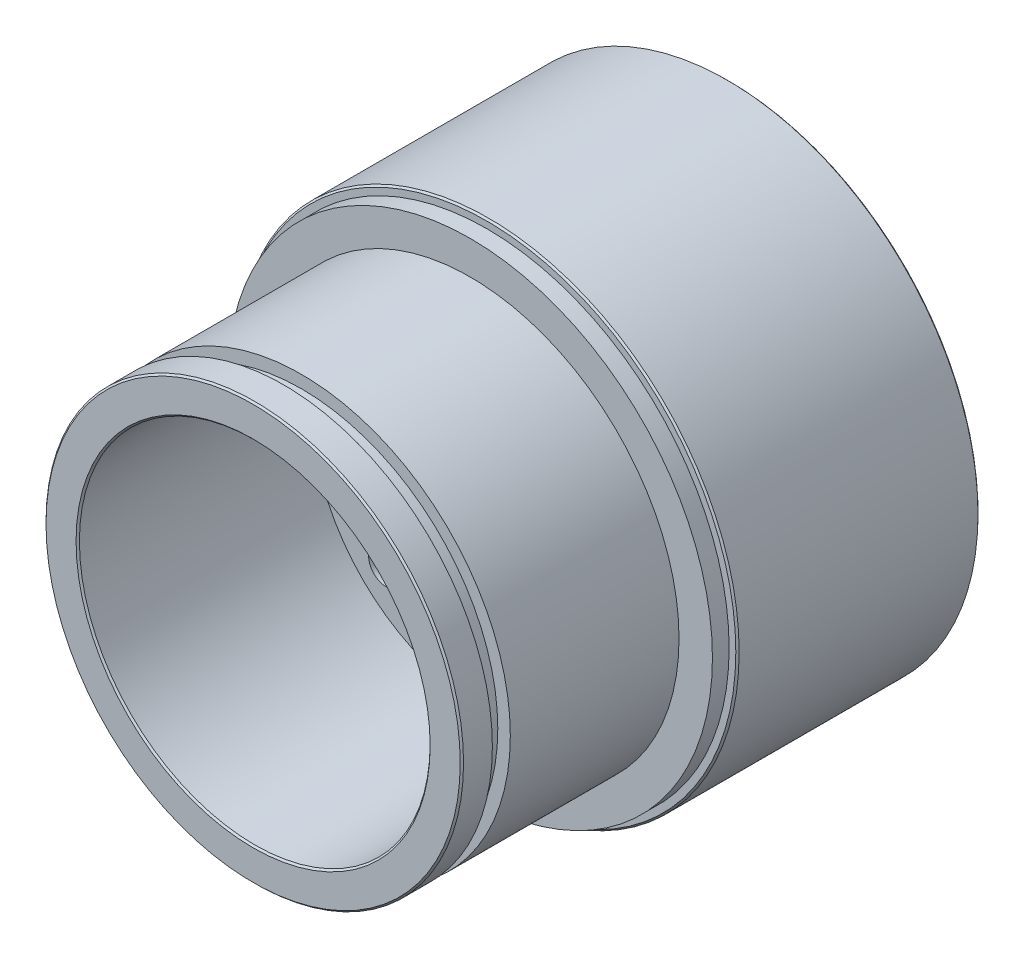
ISO-10303-21;
HEADER;
FILE_DESCRIPTION(('STEP AP214'),'2;1');
FILE_NAME('part.step','',(''),(''),'','','');
FILE_SCHEMA(('AUTOMOTIVE_DESIGN { 1 0 10303 214 1 1 1 1 }'));
ENDSEC;
DATA;
#1=APPLICATION_CONTEXT('core data for automotive mechanical design processes');
#2=APPLICATION_PROTOCOL_DEFINITION('international standard','automotive_design',2000,#1);
#3=PRODUCT_CONTEXT('',#1,'mechanical');
#4=PRODUCT('Part','Part','',(#3));
#5=PRODUCT_RELATED_PRODUCT_CATEGORY('part','',(#4));
#6=PRODUCT_DEFINITION_FORMATION('','',#4);
#7=PRODUCT_DEFINITION_CONTEXT('part definition',#1,'design');
#8=PRODUCT_DEFINITION('design','',#6,#7);
#9=PRODUCT_DEFINITION_SHAPE('','',#8);
#10=(LENGTH_UNIT() NAMED_UNIT(*) SI_UNIT(.MILLI.,.METRE.));
#11=(NAMED_UNIT(*) PLANE_ANGLE_UNIT() SI_UNIT($,.RADIAN.));
#12=(NAMED_UNIT(*) SI_UNIT($,.STERADIAN.) SOLID_ANGLE_UNIT());
#13=UNCERTAINTY_MEASURE_WITH_UNIT(LENGTH_MEASURE(1.E-05),#10,'distance_accuracy_value','');
#14=(GEOMETRIC_REPRESENTATION_CONTEXT(3) GLOBAL_UNCERTAINTY_ASSIGNED_CONTEXT((#13)) GLOBAL_UNIT_ASSIGNED_CONTEXT((#10,
#11,#12)) REPRESENTATION_CONTEXT('',''));
#15=CARTESIAN_POINT('',(0.,0.,0.));
#16=DIRECTION('',(0.,0.,1.));
#17=DIRECTION('',(1.,0.,0.));
#18=AXIS2_PLACEMENT_3D('',#15,#16,#17);
#19=CARTESIAN_POINT('',(0.,0.,0.));
#20=DIRECTION('',(0.,0.,1.));
#21=DIRECTION('',(1.,0.,0.));
#22=AXIS2_PLACEMENT_3D('',#19,#20,#21);
#23=CYLINDRICAL_SURFACE('',#22,25.);
#24=CARTESIAN_POINT('',(0.,0.,27.8));
#25=DIRECTION('',(0.,0.,1.));
#26=DIRECTION('',(1.,0.,0.));
#27=AXIS2_PLACEMENT_3D('',#24,#25,#26);
#28=CIRCLE('',#27,25.);
#29=CARTESIAN_POINT('',(25.,0.,27.8));
#30=VERTEX_POINT('',#29);
#31=EDGE_CURVE('E46',#30,#30,#28,.F.);
#32=ORIENTED_EDGE('',*,*,#31,.T.);
#33=EDGE_LOOP('',(#32));
#34=FACE_BOUND('',#33,.T.);
#35=CARTESIAN_POINT('',(0.,0.,24.35));
#36=DIRECTION('',(0.,0.,-1.));
#37=DIRECTION('',(-1.,0.,0.));
#38=AXIS2_PLACEMENT_3D('',#35,#36,#37);
#39=CIRCLE('',#38,25.);
#40=CARTESIAN_POINT('',(-25.,0.,24.35));
#41=VERTEX_POINT('',#40);
#42=EDGE_CURVE('E140',#41,#41,#39,.T.);
#43=ORIENTED_EDGE('',*,*,#42,.F.);
#44=EDGE_LOOP('',(#43));
#45=FACE_BOUND('',#44,.T.);
#46=ADVANCED_FACE('F37',(#34,#45),#23,.T.);
#47=CARTESIAN_POINT('',(0.,0.,2.));
#48=DIRECTION('',(0.,0.,1.));
#49=DIRECTION('',(1.,0.,0.));
#50=AXIS2_PLACEMENT_3D('',#47,#48,#49);
#51=CIRCLE('',#50,25.);
#52=CARTESIAN_POINT('',(25.,0.,2.));
#53=VERTEX_POINT('',#52);
#54=EDGE_CURVE('E155',#53,#53,#51,.T.);
#55=ORIENTED_EDGE('',*,*,#54,.T.);
#56=EDGE_LOOP('',(#55));
#57=FACE_BOUND('',#56,.T.);
#58=CARTESIAN_POINT('',(0.,0.,22.2));
#59=DIRECTION('',(0.,0.,-1.));
#60=DIRECTION('',(-1.,0.,0.));
#61=AXIS2_PLACEMENT_3D('',#58,#59,#60);
#62=CIRCLE('',#61,25.);
#63=CARTESIAN_POINT('',(-25.,0.,22.2));
#64=VERTEX_POINT('',#63);
#65=EDGE_CURVE('E131',#64,#64,#62,.T.);
#66=ORIENTED_EDGE('',*,*,#65,.T.);
#67=EDGE_LOOP('',(#66));
#68=FACE_BOUND('',#67,.T.);
#69=ADVANCED_FACE('F227',(#57,#68),#23,.T.);
#70=CARTESIAN_POINT('',(0.,0.,0.));
#71=DIRECTION('',(0.,0.,1.));
#72=DIRECTION('',(1.,0.,0.));
#73=AXIS2_PLACEMENT_3D('',#70,#71,#72);
#74=CYLINDRICAL_SURFACE('',#73,13.);
#75=CARTESIAN_POINT('',(0.,0.,0.));
#76=DIRECTION('',(0.,0.,1.));
#77=DIRECTION('',(1.,0.,0.));
#78=AXIS2_PLACEMENT_3D('',#75,#76,#77);
#79=CIRCLE('',#78,13.);
#80=CARTESIAN_POINT('',(13.,0.,0.));
#81=VERTEX_POINT('',#80);
#82=EDGE_CURVE('E161',#81,#81,#79,.T.);
#83=ORIENTED_EDGE('',*,*,#82,.T.);
#84=EDGE_LOOP('',(#83));
#85=FACE_BOUND('',#84,.T.);
#86=CARTESIAN_POINT('',(0.,0.,-4.));
#87=DIRECTION('',(0.,0.,1.));
#88=DIRECTION('',(1.,0.,0.));
#89=AXIS2_PLACEMENT_3D('',#86,#87,#88);
#90=CIRCLE('',#89,13.);
#91=CARTESIAN_POINT('',(13.,0.,-4.));
#92=VERTEX_POINT('',#91);
#93=EDGE_CURVE('E143',#92,#92,#90,.T.);
#94=ORIENTED_EDGE('',*,*,#93,.F.);
#95=EDGE_LOOP('',(#94));
#96=FACE_BOUND('',#95,.T.);
#97=ADVANCED_FACE('F220',(#85,#96),#74,.F.);
#98=CARTESIAN_POINT('',(13.,0.,0.));
#99=DIRECTION('',(0.,0.,1.));
#100=DIRECTION('',(1.,0.,0.));
#101=AXIS2_PLACEMENT_3D('',#98,#99,#100);
#102=PLANE('',#101);
#103=CARTESIAN_POINT('',(12.0208152801712,12.0208152801714,0.));
#104=DIRECTION('',(0.,0.,1.));
#105=DIRECTION('',(0.,-1.,0.));
#106=AXIS2_PLACEMENT_3D('',#103,#104,#105);
#107=CIRCLE('',#106,2.15);
#108=CARTESIAN_POINT('',(12.0208152801712,9.87081528017138,0.));
#109=VERTEX_POINT('',#108);
#110=EDGE_CURVE('E110',#109,#109,#107,.T.);
#111=ORIENTED_EDGE('',*,*,#110,.F.);
#112=EDGE_LOOP('',(#111));
#113=FACE_BOUND('',#112,.T.);
#114=CARTESIAN_POINT('',(12.0208152801712,-12.0208152801714,0.));
#115=DIRECTION('',(0.,0.,1.));
#116=DIRECTION('',(1.,0.,0.));
#117=AXIS2_PLACEMENT_3D('',#114,#115,#116);
#118=CIRCLE('',#117,2.15);
#119=CARTESIAN_POINT('',(14.1708152801712,-12.0208152801714,0.));
#120=VERTEX_POINT('',#119);
#121=EDGE_CURVE('E116',#120,#120,#118,.T.);
#122=ORIENTED_EDGE('',*,*,#121,.F.);
#123=EDGE_LOOP('',(#122));
#124=FACE_BOUND('',#123,.T.);
#125=CARTESIAN_POINT('',(-12.0208152801713,-12.0208152801713,0.));
#126=DIRECTION('',(0.,0.,1.));
#127=DIRECTION('',(0.,-1.,0.));
#128=AXIS2_PLACEMENT_3D('',#125,#126,#127);
#129=CIRCLE('',#128,2.15);
#130=CARTESIAN_POINT('',(-12.0208152801713,-14.1708152801713,0.));
#131=VERTEX_POINT('',#130);
#132=EDGE_CURVE('E119',#131,#131,#129,.T.);
#133=ORIENTED_EDGE('',*,*,#132,.F.);
#134=EDGE_LOOP('',(#133));
#135=FACE_BOUND('',#134,.T.);
#136=CARTESIAN_POINT('',(-12.0208152801712,12.0208152801714,0.));
#137=DIRECTION('',(0.,0.,1.));
#138=DIRECTION('',(1.,0.,0.));
#139=AXIS2_PLACEMENT_3D('',#136,#137,#138);
#140=CIRCLE('',#139,2.15);
#141=CARTESIAN_POINT('',(-9.87081528017125,12.0208152801714,0.));
#142=VERTEX_POINT('',#141);
#143=EDGE_CURVE('E125',#142,#142,#140,.T.);
#144=ORIENTED_EDGE('',*,*,#143,.F.);
#145=EDGE_LOOP('',(#144));
#146=FACE_BOUND('',#145,.T.);
#147=CARTESIAN_POINT('',(0.,0.,0.));
#148=DIRECTION('',(0.,0.,1.));
#149=DIRECTION('',(1.,0.,0.));
#150=AXIS2_PLACEMENT_3D('',#147,#148,#149);
#151=CIRCLE('',#150,21.);
#152=CARTESIAN_POINT('',(21.,0.,0.));
#153=VERTEX_POINT('',#152);
#154=EDGE_CURVE('E158',#153,#153,#151,.T.);
#155=ORIENTED_EDGE('',*,*,#154,.T.);
#156=EDGE_LOOP('',(#155));
#157=FACE_BOUND('',#156,.T.);
#158=ORIENTED_EDGE('',*,*,#82,.F.);
#159=EDGE_LOOP('',(#158));
#160=FACE_BOUND('',#159,.T.);
#161=ADVANCED_FACE('F214',(#113,#124,#135,#146,#157,#160),#102,.T.);
#162=CARTESIAN_POINT('',(0.,0.,0.));
#163=DIRECTION('',(0.,0.,1.));
#164=DIRECTION('',(1.,0.,0.));
#165=AXIS2_PLACEMENT_3D('',#162,#163,#164);
#166=CYLINDRICAL_SURFACE('',#165,21.);
#167=CARTESIAN_POINT('',(0.,0.,27.8));
#168=DIRECTION('',(0.,0.,1.));
#169=DIRECTION('',(1.,0.,0.));
#170=AXIS2_PLACEMENT_3D('',#167,#168,#169);
#171=CIRCLE('',#170,21.);
#172=CARTESIAN_POINT('',(21.,0.,27.8));
#173=VERTEX_POINT('',#172);
#174=EDGE_CURVE('E12',#173,#173,#171,.T.);
#175=ORIENTED_EDGE('',*,*,#174,.T.);
#176=EDGE_LOOP('',(#175));
#177=FACE_BOUND('',#176,.T.);
#178=ORIENTED_EDGE('',*,*,#154,.F.);
#179=EDGE_LOOP('',(#178));
#180=FACE_BOUND('',#179,.T.);
#181=ADVANCED_FACE('F203',(#177,#180),#166,.F.);
#182=CARTESIAN_POINT('',(21.,0.,28.));
#183=DIRECTION('',(0.,0.,1.));
#184=DIRECTION('',(1.,0.,0.));
#185=AXIS2_PLACEMENT_3D('',#182,#183,#184);
#186=PLANE('',#185);
#187=CARTESIAN_POINT('',(0.,0.,28.));
#188=DIRECTION('',(0.,0.,1.));
#189=DIRECTION('',(1.,0.,0.));
#190=AXIS2_PLACEMENT_3D('',#187,#188,#189);
#191=CIRCLE('',#190,24.8);
#192=CARTESIAN_POINT('',(24.8,0.,28.));
#193=VERTEX_POINT('',#192);
#194=EDGE_CURVE('E185',#193,#193,#191,.T.);
#195=ORIENTED_EDGE('',*,*,#194,.T.);
#196=EDGE_LOOP('',(#195));
#197=FACE_BOUND('',#196,.T.);
#198=CARTESIAN_POINT('',(0.,0.,28.));
#199=DIRECTION('',(0.,0.,1.));
#200=DIRECTION('',(1.,0.,0.));
#201=AXIS2_PLACEMENT_3D('',#198,#199,#200);
#202=CIRCLE('',#201,21.2);
#203=CARTESIAN_POINT('',(21.2,0.,28.));
#204=VERTEX_POINT('',#203);
#205=EDGE_CURVE('E182',#204,#204,#202,.F.);
#206=ORIENTED_EDGE('',*,*,#205,.T.);
#207=EDGE_LOOP('',(#206));
#208=FACE_BOUND('',#207,.T.);
#209=ADVANCED_FACE('F199',(#197,#208),#186,.T.);
#210=CARTESIAN_POINT('',(25.,0.,2.));
#211=DIRECTION('',(0.,0.,1.));
#212=DIRECTION('',(1.,0.,0.));
#213=AXIS2_PLACEMENT_3D('',#210,#211,#212);
#214=PLANE('',#213);
#215=CARTESIAN_POINT('',(0.,0.,2.));
#216=DIRECTION('',(0.,0.,1.));
#217=DIRECTION('',(1.,0.,0.));
#218=AXIS2_PLACEMENT_3D('',#215,#216,#217);
#219=CIRCLE('',#218,29.);
#220=CARTESIAN_POINT('',(29.,0.,2.));
#221=VERTEX_POINT('',#220);
#222=EDGE_CURVE('E152',#221,#221,#219,.T.);
#223=ORIENTED_EDGE('',*,*,#222,.T.);
#224=EDGE_LOOP('',(#223));
#225=FACE_BOUND('',#224,.T.);
#226=ORIENTED_EDGE('',*,*,#54,.F.);
#227=EDGE_LOOP('',(#226));
#228=FACE_BOUND('',#227,.T.);
#229=ADVANCED_FACE('F202',(#225,#228),#214,.T.);
#230=CARTESIAN_POINT('',(0.,0.,0.));
#231=DIRECTION('',(0.,0.,1.));
#232=DIRECTION('',(1.,0.,0.));
#233=AXIS2_PLACEMENT_3D('',#230,#231,#232);
#234=CYLINDRICAL_SURFACE('',#233,29.);
#235=CARTESIAN_POINT('',(0.,0.,0.));
#236=DIRECTION('',(0.,0.,1.));
#237=DIRECTION('',(1.,0.,0.));
#238=AXIS2_PLACEMENT_3D('',#235,#236,#237);
#239=CIRCLE('',#238,29.);
#240=CARTESIAN_POINT('',(29.,0.,0.));
#241=VERTEX_POINT('',#240);
#242=EDGE_CURVE('E149',#241,#241,#239,.T.);
#243=ORIENTED_EDGE('',*,*,#242,.T.);
#244=EDGE_LOOP('',(#243));
#245=FACE_BOUND('',#244,.T.);
#246=ORIENTED_EDGE('',*,*,#222,.F.);
#247=EDGE_LOOP('',(#246));
#248=FACE_BOUND('',#247,.T.);
#249=ADVANCED_FACE('F283',(#245,#248),#234,.T.);
#250=CARTESIAN_POINT('',(29.,0.,0.));
#251=DIRECTION('',(0.,0.,1.));
#252=DIRECTION('',(1.,0.,0.));
#253=AXIS2_PLACEMENT_3D('',#250,#251,#252);
#254=PLANE('',#253);
#255=CARTESIAN_POINT('',(0.,0.,0.));
#256=DIRECTION('',(0.,0.,1.));
#257=DIRECTION('',(1.,0.,0.));
#258=AXIS2_PLACEMENT_3D('',#255,#256,#257);
#259=CIRCLE('',#258,29.8);
#260=CARTESIAN_POINT('',(29.8,0.,0.));
#261=VERTEX_POINT('',#260);
#262=EDGE_CURVE('E164',#261,#261,#259,.T.);
#263=ORIENTED_EDGE('',*,*,#262,.T.);
#264=EDGE_LOOP('',(#263));
#265=FACE_BOUND('',#264,.T.);
#266=ORIENTED_EDGE('',*,*,#242,.F.);
#267=EDGE_LOOP('',(#266));
#268=FACE_BOUND('',#267,.T.);
#269=ADVANCED_FACE('F277',(#265,#268),#254,.T.);
#270=CARTESIAN_POINT('',(0.,0.,0.));
#271=DIRECTION('',(0.,0.,1.));
#272=DIRECTION('',(1.,0.,0.));
#273=AXIS2_PLACEMENT_3D('',#270,#271,#272);
#274=CYLINDRICAL_SURFACE('',#273,30.);
#275=CARTESIAN_POINT('',(0.,0.,-0.200000000000023));
#276=DIRECTION('',(0.,0.,1.));
#277=DIRECTION('',(1.,0.,0.));
#278=AXIS2_PLACEMENT_3D('',#275,#276,#277);
#279=CIRCLE('',#278,30.);
#280=CARTESIAN_POINT('',(30.,0.,-0.200000000000023));
#281=VERTEX_POINT('',#280);
#282=EDGE_CURVE('E170',#281,#281,#279,.F.);
#283=ORIENTED_EDGE('',*,*,#282,.T.);
#284=EDGE_LOOP('',(#283));
#285=FACE_BOUND('',#284,.T.);
#286=CARTESIAN_POINT('',(0.,0.,-28.8));
#287=DIRECTION('',(0.,0.,-1.));
#288=DIRECTION('',(-1.,0.,0.));
#289=AXIS2_PLACEMENT_3D('',#286,#287,#288);
#290=CIRCLE('',#289,30.);
#291=CARTESIAN_POINT('',(-30.,0.,-28.8));
#292=VERTEX_POINT('',#291);
#293=EDGE_CURVE('E167',#292,#292,#290,.F.);
#294=ORIENTED_EDGE('',*,*,#293,.T.);
#295=EDGE_LOOP('',(#294));
#296=FACE_BOUND('',#295,.T.);
#297=ADVANCED_FACE('F247',(#285,#296),#274,.T.);
#298=CARTESIAN_POINT('',(30.,0.,-29.));
#299=DIRECTION('',(0.,0.,-1.));
#300=DIRECTION('',(-1.,0.,0.));
#301=AXIS2_PLACEMENT_3D('',#298,#299,#300);
#302=PLANE('',#301);
#303=CARTESIAN_POINT('',(-21.6506350946108,12.5000000000003,-29.));
#304=DIRECTION('',(0.,0.,-1.));
#305=DIRECTION('',(0.,1.,0.));
#306=AXIS2_PLACEMENT_3D('',#303,#304,#305);
#307=CIRCLE('',#306,1.65);
#308=CARTESIAN_POINT('',(-21.6506350946108,14.1500000000003,-29.));
#309=VERTEX_POINT('',#308);
#310=EDGE_CURVE('E76',#309,#309,#307,.T.);
#311=ORIENTED_EDGE('',*,*,#310,.F.);
#312=EDGE_LOOP('',(#311));
#313=FACE_BOUND('',#312,.T.);
#314=CARTESIAN_POINT('',(-21.6506350946111,-12.4999999999998,-29.));
#315=DIRECTION('',(0.,0.,-1.));
#316=DIRECTION('',(0.,1.,0.));
#317=AXIS2_PLACEMENT_3D('',#314,#315,#316);
#318=CIRCLE('',#317,1.65);
#319=CARTESIAN_POINT('',(-21.6506350946111,-10.8499999999998,-29.));
#320=VERTEX_POINT('',#319);
#321=EDGE_CURVE('E75',#320,#320,#318,.T.);
#322=ORIENTED_EDGE('',*,*,#321,.F.);
#323=EDGE_LOOP('',(#322));
#324=FACE_BOUND('',#323,.T.);
#325=CARTESIAN_POINT('',(0.,-25.,-29.));
#326=DIRECTION('',(0.,0.,-1.));
#327=DIRECTION('',(-1.,0.,0.));
#328=AXIS2_PLACEMENT_3D('',#325,#326,#327);
#329=CIRCLE('',#328,1.65);
#330=CARTESIAN_POINT('',(-1.65,-25.,-29.));
#331=VERTEX_POINT('',#330);
#332=EDGE_CURVE('E86',#331,#331,#329,.T.);
#333=ORIENTED_EDGE('',*,*,#332,.F.);
#334=EDGE_LOOP('',(#333));
#335=FACE_BOUND('',#334,.T.);
#336=CARTESIAN_POINT('',(21.6506350946109,-12.5000000000001,-29.));
#337=DIRECTION('',(0.,0.,-1.));
#338=DIRECTION('',(0.,1.,0.));
#339=AXIS2_PLACEMENT_3D('',#336,#337,#338);
#340=CIRCLE('',#339,1.65);
#341=CARTESIAN_POINT('',(21.6506350946109,-10.8500000000001,-29.));
#342=VERTEX_POINT('',#341);
#343=EDGE_CURVE('E92',#342,#342,#340,.T.);
#344=ORIENTED_EDGE('',*,*,#343,.F.);
#345=EDGE_LOOP('',(#344));
#346=FACE_BOUND('',#345,.T.);
#347=CARTESIAN_POINT('',(21.650635094611,12.5,-29.));
#348=DIRECTION('',(0.,0.,-1.));
#349=DIRECTION('',(0.,1.,0.));
#350=AXIS2_PLACEMENT_3D('',#347,#348,#349);
#351=CIRCLE('',#350,1.65);
#352=CARTESIAN_POINT('',(21.650635094611,14.1499999999999,-29.));
#353=VERTEX_POINT('',#352);
#354=EDGE_CURVE('E98',#353,#353,#351,.T.);
#355=ORIENTED_EDGE('',*,*,#354,.F.);
#356=EDGE_LOOP('',(#355));
#357=FACE_BOUND('',#356,.T.);
#358=CARTESIAN_POINT('',(0.,25.,-29.));
#359=DIRECTION('',(0.,0.,-1.));
#360=DIRECTION('',(-1.,0.,0.));
#361=AXIS2_PLACEMENT_3D('',#358,#359,#360);
#362=CIRCLE('',#361,1.65);
#363=CARTESIAN_POINT('',(-1.65,25.,-29.));
#364=VERTEX_POINT('',#363);
#365=EDGE_CURVE('E104',#364,#364,#362,.T.);
#366=ORIENTED_EDGE('',*,*,#365,.F.);
#367=EDGE_LOOP('',(#366));
#368=FACE_BOUND('',#367,.T.);
#369=CARTESIAN_POINT('',(0.,0.,-29.));
#370=DIRECTION('',(0.,0.,-1.));
#371=DIRECTION('',(-1.,0.,0.));
#372=AXIS2_PLACEMENT_3D('',#369,#370,#371);
#373=CIRCLE('',#372,20.7);
#374=CARTESIAN_POINT('',(-20.7,0.,-29.));
#375=VERTEX_POINT('',#374);
#376=EDGE_CURVE('E176',#375,#375,#373,.F.);
#377=ORIENTED_EDGE('',*,*,#376,.T.);
#378=EDGE_LOOP('',(#377));
#379=FACE_BOUND('',#378,.T.);
#380=CARTESIAN_POINT('',(0.,0.,-29.));
#381=DIRECTION('',(0.,0.,-1.));
#382=DIRECTION('',(-1.,0.,0.));
#383=AXIS2_PLACEMENT_3D('',#380,#381,#382);
#384=CIRCLE('',#383,29.8);
#385=CARTESIAN_POINT('',(-29.8,0.,-29.));
#386=VERTEX_POINT('',#385);
#387=EDGE_CURVE('E173',#386,#386,#384,.T.);
#388=ORIENTED_EDGE('',*,*,#387,.T.);
#389=EDGE_LOOP('',(#388));
#390=FACE_BOUND('',#389,.T.);
#391=ADVANCED_FACE('F241',(#313,#324,#335,#346,#357,#368,#379,#390),#302,.T.);
#392=CARTESIAN_POINT('',(0.,0.,0.));
#393=DIRECTION('',(0.,0.,1.));
#394=DIRECTION('',(1.,0.,0.));
#395=AXIS2_PLACEMENT_3D('',#392,#393,#394);
#396=CYLINDRICAL_SURFACE('',#395,20.5);
#397=CARTESIAN_POINT('',(0.,0.,-28.8));
#398=DIRECTION('',(0.,0.,-1.));
#399=DIRECTION('',(-1.,0.,0.));
#400=AXIS2_PLACEMENT_3D('',#397,#398,#399);
#401=CIRCLE('',#400,20.5);
#402=CARTESIAN_POINT('',(-20.5,0.,-28.8));
#403=VERTEX_POINT('',#402);
#404=EDGE_CURVE('E179',#403,#403,#401,.T.);
#405=ORIENTED_EDGE('',*,*,#404,.T.);
#406=EDGE_LOOP('',(#405));
#407=FACE_BOUND('',#406,.T.);
#408=CARTESIAN_POINT('',(0.,0.,-4.));
#409=DIRECTION('',(0.,0.,1.));
#410=DIRECTION('',(1.,0.,0.));
#411=AXIS2_PLACEMENT_3D('',#408,#409,#410);
#412=CIRCLE('',#411,20.5);
#413=CARTESIAN_POINT('',(20.5,0.,-4.));
#414=VERTEX_POINT('',#413);
#415=EDGE_CURVE('E146',#414,#414,#412,.T.);
#416=ORIENTED_EDGE('',*,*,#415,.T.);
#417=EDGE_LOOP('',(#416));
#418=FACE_BOUND('',#417,.T.);
#419=ADVANCED_FACE('F235',(#407,#418),#396,.F.);
#420=CARTESIAN_POINT('',(20.5,0.,-4.));
#421=DIRECTION('',(0.,0.,-1.));
#422=DIRECTION('',(-1.,0.,0.));
#423=AXIS2_PLACEMENT_3D('',#420,#421,#422);
#424=PLANE('',#423);
#425=CARTESIAN_POINT('',(12.0208152801712,12.0208152801714,-4.));
#426=DIRECTION('',(0.,0.,-1.));
#427=DIRECTION('',(-1.,0.,0.));
#428=AXIS2_PLACEMENT_3D('',#425,#426,#427);
#429=CIRCLE('',#428,2.15);
#430=CARTESIAN_POINT('',(9.87081528017125,12.0208152801714,-4.));
#431=VERTEX_POINT('',#430);
#432=EDGE_CURVE('E113',#431,#431,#429,.T.);
#433=ORIENTED_EDGE('',*,*,#432,.F.);
#434=EDGE_LOOP('',(#433));
#435=FACE_BOUND('',#434,.T.);
#436=CARTESIAN_POINT('',(12.0208152801712,-12.0208152801714,-4.));
#437=DIRECTION('',(0.,0.,-1.));
#438=DIRECTION('',(-1.,0.,0.));
#439=AXIS2_PLACEMENT_3D('',#436,#437,#438);
#440=CIRCLE('',#439,2.15);
#441=CARTESIAN_POINT('',(9.87081528017125,-12.0208152801714,-4.));
#442=VERTEX_POINT('',#441);
#443=EDGE_CURVE('E41',#442,#442,#440,.T.);
#444=ORIENTED_EDGE('',*,*,#443,.F.);
#445=EDGE_LOOP('',(#444));
#446=FACE_BOUND('',#445,.T.);
#447=CARTESIAN_POINT('',(-12.0208152801713,-12.0208152801713,-4.));
#448=DIRECTION('',(0.,0.,-1.));
#449=DIRECTION('',(-1.,0.,0.));
#450=AXIS2_PLACEMENT_3D('',#447,#448,#449);
#451=CIRCLE('',#450,2.15);
#452=CARTESIAN_POINT('',(-14.1708152801713,-12.0208152801713,-4.));
#453=VERTEX_POINT('',#452);
#454=EDGE_CURVE('E122',#453,#453,#451,.T.);
#455=ORIENTED_EDGE('',*,*,#454,.F.);
#456=EDGE_LOOP('',(#455));
#457=FACE_BOUND('',#456,.T.);
#458=CARTESIAN_POINT('',(-12.0208152801712,12.0208152801714,-4.));
#459=DIRECTION('',(0.,0.,-1.));
#460=DIRECTION('',(-1.,0.,0.));
#461=AXIS2_PLACEMENT_3D('',#458,#459,#460);
#462=CIRCLE('',#461,2.15);
#463=CARTESIAN_POINT('',(-14.1708152801712,12.0208152801714,-4.));
#464=VERTEX_POINT('',#463);
#465=EDGE_CURVE('E128',#464,#464,#462,.T.);
#466=ORIENTED_EDGE('',*,*,#465,.F.);
#467=EDGE_LOOP('',(#466));
#468=FACE_BOUND('',#467,.T.);
#469=ORIENTED_EDGE('',*,*,#93,.T.);
#470=EDGE_LOOP('',(#469));
#471=FACE_BOUND('',#470,.T.);
#472=ORIENTED_EDGE('',*,*,#415,.F.);
#473=EDGE_LOOP('',(#472));
#474=FACE_BOUND('',#473,.T.);
#475=ADVANCED_FACE('F231',(#435,#446,#457,#468,#471,#474),#424,.T.);
#476=CARTESIAN_POINT('',(25.,0.,24.35));
#477=DIRECTION('',(0.,0.,-1.));
#478=DIRECTION('',(-1.,0.,0.));
#479=AXIS2_PLACEMENT_3D('',#476,#477,#478);
#480=PLANE('',#479);
#481=ORIENTED_EDGE('',*,*,#42,.T.);
#482=EDGE_LOOP('',(#481));
#483=FACE_BOUND('',#482,.T.);
#484=CARTESIAN_POINT('',(0.,0.,24.35));
#485=DIRECTION('',(0.,0.,-1.));
#486=DIRECTION('',(-1.,0.,0.));
#487=AXIS2_PLACEMENT_3D('',#484,#485,#486);
#488=CIRCLE('',#487,23.5);
#489=CARTESIAN_POINT('',(-23.5,0.,24.35));
#490=VERTEX_POINT('',#489);
#491=EDGE_CURVE('E137',#490,#490,#488,.T.);
#492=ORIENTED_EDGE('',*,*,#491,.F.);
#493=EDGE_LOOP('',(#492));
#494=FACE_BOUND('',#493,.T.);
#495=ADVANCED_FACE('F234',(#483,#494),#480,.T.);
#496=CARTESIAN_POINT('',(0.,0.,0.));
#497=DIRECTION('',(0.,0.,-1.));
#498=DIRECTION('',(-1.,0.,0.));
#499=AXIS2_PLACEMENT_3D('',#496,#497,#498);
#500=CYLINDRICAL_SURFACE('',#499,23.5);
#501=ORIENTED_EDGE('',*,*,#491,.T.);
#502=EDGE_LOOP('',(#501));
#503=FACE_BOUND('',#502,.T.);
#504=CARTESIAN_POINT('',(0.,0.,22.2));
#505=DIRECTION('',(0.,0.,-1.));
#506=DIRECTION('',(-1.,0.,0.));
#507=AXIS2_PLACEMENT_3D('',#504,#505,#506);
#508=CIRCLE('',#507,23.5);
#509=CARTESIAN_POINT('',(-23.5,0.,22.2));
#510=VERTEX_POINT('',#509);
#511=EDGE_CURVE('E134',#510,#510,#508,.T.);
#512=ORIENTED_EDGE('',*,*,#511,.F.);
#513=EDGE_LOOP('',(#512));
#514=FACE_BOUND('',#513,.T.);
#515=ADVANCED_FACE('F301',(#503,#514),#500,.T.);
#516=CARTESIAN_POINT('',(25.,0.,22.2));
#517=DIRECTION('',(0.,0.,1.));
#518=DIRECTION('',(1.,0.,0.));
#519=AXIS2_PLACEMENT_3D('',#516,#517,#518);
#520=PLANE('',#519);
#521=ORIENTED_EDGE('',*,*,#511,.T.);
#522=EDGE_LOOP('',(#521));
#523=FACE_BOUND('',#522,.T.);
#524=ORIENTED_EDGE('',*,*,#65,.F.);
#525=EDGE_LOOP('',(#524));
#526=FACE_BOUND('',#525,.T.);
#527=ADVANCED_FACE('F263',(#523,#526),#520,.T.);
#528=CARTESIAN_POINT('',(0.,0.,0.));
#529=DIRECTION('',(0.,0.,-1.));
#530=DIRECTION('',(-1.,0.,0.));
#531=AXIS2_PLACEMENT_3D('',#528,#529,#530);
#532=CONICAL_SURFACE('',#531,29.8,0.785398163397431);
#533=ORIENTED_EDGE('',*,*,#282,.F.);
#534=EDGE_LOOP('',(#533));
#535=FACE_BOUND('',#534,.T.);
#536=ORIENTED_EDGE('',*,*,#262,.F.);
#537=EDGE_LOOP('',(#536));
#538=FACE_BOUND('',#537,.T.);
#539=ADVANCED_FACE('F259',(#535,#538),#532,.T.);
#540=CARTESIAN_POINT('',(0.,0.,-29.));
#541=DIRECTION('',(0.,0.,-1.));
#542=DIRECTION('',(-1.,0.,0.));
#543=AXIS2_PLACEMENT_3D('',#540,#541,#542);
#544=CONICAL_SURFACE('',#543,20.7,0.785398163397457);
#545=ORIENTED_EDGE('',*,*,#404,.F.);
#546=EDGE_LOOP('',(#545));
#547=FACE_BOUND('',#546,.T.);
#548=ORIENTED_EDGE('',*,*,#376,.F.);
#549=EDGE_LOOP('',(#548));
#550=FACE_BOUND('',#549,.T.);
#551=ADVANCED_FACE('F262',(#547,#550),#544,.F.);
#552=CARTESIAN_POINT('',(0.,0.,-28.8));
#553=DIRECTION('',(0.,0.,1.));
#554=DIRECTION('',(1.,0.,0.));
#555=AXIS2_PLACEMENT_3D('',#552,#553,#554);
#556=CONICAL_SURFACE('',#555,30.,0.78539816339744);
#557=ORIENTED_EDGE('',*,*,#387,.F.);
#558=EDGE_LOOP('',(#557));
#559=FACE_BOUND('',#558,.T.);
#560=ORIENTED_EDGE('',*,*,#293,.F.);
#561=EDGE_LOOP('',(#560));
#562=FACE_BOUND('',#561,.T.);
#563=ADVANCED_FACE('F196',(#559,#562),#556,.T.);
#564=CARTESIAN_POINT('',(0.,0.,28.));
#565=DIRECTION('',(0.,0.,-1.));
#566=DIRECTION('',(-1.,0.,0.));
#567=AXIS2_PLACEMENT_3D('',#564,#565,#566);
#568=CONICAL_SURFACE('',#567,24.8,0.785398163397457);
#569=ORIENTED_EDGE('',*,*,#31,.F.);
#570=EDGE_LOOP('',(#569));
#571=FACE_BOUND('',#570,.T.);
#572=ORIENTED_EDGE('',*,*,#194,.F.);
#573=EDGE_LOOP('',(#572));
#574=FACE_BOUND('',#573,.T.);
#575=ADVANCED_FACE('F193',(#571,#574),#568,.T.);
#576=CARTESIAN_POINT('',(0.,0.,27.8));
#577=DIRECTION('',(0.,0.,1.));
#578=DIRECTION('',(1.,0.,0.));
#579=AXIS2_PLACEMENT_3D('',#576,#577,#578);
#580=CONICAL_SURFACE('',#579,21.,0.785398163397414);
#581=ORIENTED_EDGE('',*,*,#205,.F.);
#582=EDGE_LOOP('',(#581));
#583=FACE_BOUND('',#582,.T.);
#584=ORIENTED_EDGE('',*,*,#174,.F.);
#585=EDGE_LOOP('',(#584));
#586=FACE_BOUND('',#585,.T.);
#587=ADVANCED_FACE('F39',(#583,#586),#580,.F.);
#588=CARTESIAN_POINT('',(-12.0208152801712,12.0208152801714,0.));
#589=DIRECTION('',(0.,0.,1.));
#590=DIRECTION('',(1.,0.,0.));
#591=AXIS2_PLACEMENT_3D('',#588,#589,#590);
#592=CYLINDRICAL_SURFACE('',#591,2.15);
#593=ORIENTED_EDGE('',*,*,#465,.T.);
#594=EDGE_LOOP('',(#593));
#595=FACE_BOUND('',#594,.T.);
#596=ORIENTED_EDGE('',*,*,#143,.T.);
#597=EDGE_LOOP('',(#596));
#598=FACE_BOUND('',#597,.T.);
#599=ADVANCED_FACE('F209',(#595,#598),#592,.F.);
#600=CARTESIAN_POINT('',(-12.0208152801713,-12.0208152801713,0.));
#601=DIRECTION('',(0.,0.,1.));
#602=DIRECTION('',(0.,-1.,0.));
#603=AXIS2_PLACEMENT_3D('',#600,#601,#602);
#604=CYLINDRICAL_SURFACE('',#603,2.15);
#605=ORIENTED_EDGE('',*,*,#454,.T.);
#606=EDGE_LOOP('',(#605));
#607=FACE_BOUND('',#606,.T.);
#608=ORIENTED_EDGE('',*,*,#132,.T.);
#609=EDGE_LOOP('',(#608));
#610=FACE_BOUND('',#609,.T.);
#611=ADVANCED_FACE('F405',(#607,#610),#604,.F.);
#612=CARTESIAN_POINT('',(12.0208152801712,-12.0208152801714,0.));
#613=DIRECTION('',(0.,0.,1.));
#614=DIRECTION('',(1.,0.,0.));
#615=AXIS2_PLACEMENT_3D('',#612,#613,#614);
#616=CYLINDRICAL_SURFACE('',#615,2.15);
#617=ORIENTED_EDGE('',*,*,#443,.T.);
#618=EDGE_LOOP('',(#617));
#619=FACE_BOUND('',#618,.T.);
#620=ORIENTED_EDGE('',*,*,#121,.T.);
#621=EDGE_LOOP('',(#620));
#622=FACE_BOUND('',#621,.T.);
#623=ADVANCED_FACE('F423',(#619,#622),#616,.F.);
#624=CARTESIAN_POINT('',(12.0208152801712,12.0208152801714,0.));
#625=DIRECTION('',(0.,0.,1.));
#626=DIRECTION('',(0.,-1.,0.));
#627=AXIS2_PLACEMENT_3D('',#624,#625,#626);
#628=CYLINDRICAL_SURFACE('',#627,2.15);
#629=ORIENTED_EDGE('',*,*,#432,.T.);
#630=EDGE_LOOP('',(#629));
#631=FACE_BOUND('',#630,.T.);
#632=ORIENTED_EDGE('',*,*,#110,.T.);
#633=EDGE_LOOP('',(#632));
#634=FACE_BOUND('',#633,.T.);
#635=ADVANCED_FACE('F432',(#631,#634),#628,.F.);
#636=CARTESIAN_POINT('',(0.,25.,-18.9));
#637=DIRECTION('',(0.,0.,-1.));
#638=DIRECTION('',(-1.,0.,0.));
#639=AXIS2_PLACEMENT_3D('',#636,#637,#638);
#640=CONICAL_SURFACE('',#639,1.65,1.02974425867665);
#641=CARTESIAN_POINT('',(0.,25.,-17.9085799786045));
#642=VERTEX_POINT('',#641);
#643=VERTEX_LOOP('',#642);
#644=FACE_BOUND('',#643,.T.);
#645=CARTESIAN_POINT('',(0.,25.,-18.9));
#646=DIRECTION('',(0.,0.,-1.));
#647=DIRECTION('',(-1.,0.,0.));
#648=AXIS2_PLACEMENT_3D('',#645,#646,#647);
#649=CIRCLE('',#648,1.65);
#650=CARTESIAN_POINT('',(-1.65,25.,-18.9));
#651=VERTEX_POINT('',#650);
#652=EDGE_CURVE('E107',#651,#651,#649,.T.);
#653=ORIENTED_EDGE('',*,*,#652,.T.);
#654=EDGE_LOOP('',(#653));
#655=FACE_BOUND('',#654,.T.);
#656=ADVANCED_FACE('F442',(#644,#655),#640,.F.);
#657=CARTESIAN_POINT('',(0.,25.,-29.));
#658=DIRECTION('',(0.,0.,-1.));
#659=DIRECTION('',(-1.,0.,0.));
#660=AXIS2_PLACEMENT_3D('',#657,#658,#659);
#661=CYLINDRICAL_SURFACE('',#660,1.65);
#662=ORIENTED_EDGE('',*,*,#652,.F.);
#663=EDGE_LOOP('',(#662));
#664=FACE_BOUND('',#663,.T.);
#665=ORIENTED_EDGE('',*,*,#365,.T.);
#666=EDGE_LOOP('',(#665));
#667=FACE_BOUND('',#666,.T.);
#668=ADVANCED_FACE('F452',(#664,#667),#661,.F.);
#669=CARTESIAN_POINT('',(21.650635094611,12.5,-18.9));
#670=DIRECTION('',(0.,0.,-1.));
#671=DIRECTION('',(0.,1.,0.));
#672=AXIS2_PLACEMENT_3D('',#669,#670,#671);
#673=CONICAL_SURFACE('',#672,1.65,1.02974425867665);
#674=CARTESIAN_POINT('',(21.650635094611,12.5,-17.9085799786045));
#675=VERTEX_POINT('',#674);
#676=VERTEX_LOOP('',#675);
#677=FACE_BOUND('',#676,.T.);
#678=CARTESIAN_POINT('',(21.650635094611,12.5,-18.9));
#679=DIRECTION('',(0.,0.,-1.));
#680=DIRECTION('',(0.,1.,0.));
#681=AXIS2_PLACEMENT_3D('',#678,#679,#680);
#682=CIRCLE('',#681,1.65);
#683=CARTESIAN_POINT('',(21.650635094611,14.1499999999999,-18.9));
#684=VERTEX_POINT('',#683);
#685=EDGE_CURVE('E101',#684,#684,#682,.T.);
#686=ORIENTED_EDGE('',*,*,#685,.T.);
#687=EDGE_LOOP('',(#686));
#688=FACE_BOUND('',#687,.T.);
#689=ADVANCED_FACE('F463',(#677,#688),#673,.F.);
#690=CARTESIAN_POINT('',(21.650635094611,12.5,-29.));
#691=DIRECTION('',(0.,0.,-1.));
#692=DIRECTION('',(0.,1.,0.));
#693=AXIS2_PLACEMENT_3D('',#690,#691,#692);
#694=CYLINDRICAL_SURFACE('',#693,1.65);
#695=ORIENTED_EDGE('',*,*,#685,.F.);
#696=EDGE_LOOP('',(#695));
#697=FACE_BOUND('',#696,.T.);
#698=ORIENTED_EDGE('',*,*,#354,.T.);
#699=EDGE_LOOP('',(#698));
#700=FACE_BOUND('',#699,.T.);
#701=ADVANCED_FACE('F480',(#697,#700),#694,.F.);
#702=CARTESIAN_POINT('',(21.6506350946109,-12.5000000000001,-18.9));
#703=DIRECTION('',(0.,0.,-1.));
#704=DIRECTION('',(0.,1.,0.));
#705=AXIS2_PLACEMENT_3D('',#702,#703,#704);
#706=CONICAL_SURFACE('',#705,1.65,1.02974425867665);
#707=CARTESIAN_POINT('',(21.6506350946109,-12.5000000000001,-17.9085799786045));
#708=VERTEX_POINT('',#707);
#709=VERTEX_LOOP('',#708);
#710=FACE_BOUND('',#709,.T.);
#711=CARTESIAN_POINT('',(21.6506350946109,-12.5000000000001,-18.9));
#712=DIRECTION('',(0.,0.,-1.));
#713=DIRECTION('',(0.,1.,0.));
#714=AXIS2_PLACEMENT_3D('',#711,#712,#713);
#715=CIRCLE('',#714,1.65);
#716=CARTESIAN_POINT('',(21.6506350946109,-10.8500000000001,-18.9));
#717=VERTEX_POINT('',#716);
#718=EDGE_CURVE('E95',#717,#717,#715,.T.);
#719=ORIENTED_EDGE('',*,*,#718,.T.);
#720=EDGE_LOOP('',(#719));
#721=FACE_BOUND('',#720,.T.);
#722=ADVANCED_FACE('F491',(#710,#721),#706,.F.);
#723=CARTESIAN_POINT('',(21.6506350946109,-12.5000000000001,-29.));
#724=DIRECTION('',(0.,0.,-1.));
#725=DIRECTION('',(0.,1.,0.));
#726=AXIS2_PLACEMENT_3D('',#723,#724,#725);
#727=CYLINDRICAL_SURFACE('',#726,1.65);
#728=ORIENTED_EDGE('',*,*,#718,.F.);
#729=EDGE_LOOP('',(#728));
#730=FACE_BOUND('',#729,.T.);
#731=ORIENTED_EDGE('',*,*,#343,.T.);
#732=EDGE_LOOP('',(#731));
#733=FACE_BOUND('',#732,.T.);
#734=ADVANCED_FACE('F502',(#730,#733),#727,.F.);
#735=CARTESIAN_POINT('',(0.,-25.,-18.9));
#736=DIRECTION('',(0.,0.,-1.));
#737=DIRECTION('',(-1.,0.,0.));
#738=AXIS2_PLACEMENT_3D('',#735,#736,#737);
#739=CONICAL_SURFACE('',#738,1.65,1.02974425867665);
#740=CARTESIAN_POINT('',(0.,-25.,-17.9085799786045));
#741=VERTEX_POINT('',#740);
#742=VERTEX_LOOP('',#741);
#743=FACE_BOUND('',#742,.T.);
#744=CARTESIAN_POINT('',(0.,-25.,-18.9));
#745=DIRECTION('',(0.,0.,-1.));
#746=DIRECTION('',(-1.,0.,0.));
#747=AXIS2_PLACEMENT_3D('',#744,#745,#746);
#748=CIRCLE('',#747,1.65);
#749=CARTESIAN_POINT('',(-1.65,-25.,-18.9));
#750=VERTEX_POINT('',#749);
#751=EDGE_CURVE('E89',#750,#750,#748,.T.);
#752=ORIENTED_EDGE('',*,*,#751,.T.);
#753=EDGE_LOOP('',(#752));
#754=FACE_BOUND('',#753,.T.);
#755=ADVANCED_FACE('F514',(#743,#754),#739,.F.);
#756=CARTESIAN_POINT('',(0.,-25.,-29.));
#757=DIRECTION('',(0.,0.,-1.));
#758=DIRECTION('',(-1.,0.,0.));
#759=AXIS2_PLACEMENT_3D('',#756,#757,#758);
#760=CYLINDRICAL_SURFACE('',#759,1.65);
#761=ORIENTED_EDGE('',*,*,#751,.F.);
#762=EDGE_LOOP('',(#761));
#763=FACE_BOUND('',#762,.T.);
#764=ORIENTED_EDGE('',*,*,#332,.T.);
#765=EDGE_LOOP('',(#764));
#766=FACE_BOUND('',#765,.T.);
#767=ADVANCED_FACE('F525',(#763,#766),#760,.F.);
#768=CARTESIAN_POINT('',(-21.6506350946111,-12.4999999999998,-18.9));
#769=DIRECTION('',(0.,0.,-1.));
#770=DIRECTION('',(0.,1.,0.));
#771=AXIS2_PLACEMENT_3D('',#768,#769,#770);
#772=CONICAL_SURFACE('',#771,1.65,1.02974425867665);
#773=CARTESIAN_POINT('',(-21.6506350946111,-12.4999999999998,-17.9085799786045));
#774=VERTEX_POINT('',#773);
#775=VERTEX_LOOP('',#774);
#776=FACE_BOUND('',#775,.T.);
#777=CARTESIAN_POINT('',(-21.6506350946111,-12.4999999999998,-18.9));
#778=DIRECTION('',(0.,0.,-1.));
#779=DIRECTION('',(0.,1.,0.));
#780=AXIS2_PLACEMENT_3D('',#777,#778,#779);
#781=CIRCLE('',#780,1.65);
#782=CARTESIAN_POINT('',(-21.6506350946111,-10.8499999999998,-18.9));
#783=VERTEX_POINT('',#782);
#784=EDGE_CURVE('E79',#783,#783,#781,.T.);
#785=ORIENTED_EDGE('',*,*,#784,.T.);
#786=EDGE_LOOP('',(#785));
#787=FACE_BOUND('',#786,.T.);
#788=ADVANCED_FACE('F536',(#776,#787),#772,.F.);
#789=CARTESIAN_POINT('',(-21.6506350946111,-12.4999999999998,-29.));
#790=DIRECTION('',(0.,0.,-1.));
#791=DIRECTION('',(0.,1.,0.));
#792=AXIS2_PLACEMENT_3D('',#789,#790,#791);
#793=CYLINDRICAL_SURFACE('',#792,1.65);
#794=ORIENTED_EDGE('',*,*,#784,.F.);
#795=EDGE_LOOP('',(#794));
#796=FACE_BOUND('',#795,.T.);
#797=ORIENTED_EDGE('',*,*,#321,.T.);
#798=EDGE_LOOP('',(#797));
#799=FACE_BOUND('',#798,.T.);
#800=ADVANCED_FACE('F69',(#796,#799),#793,.F.);
#801=CARTESIAN_POINT('',(-21.6506350946108,12.5000000000003,-18.9));
#802=DIRECTION('',(0.,0.,-1.));
#803=DIRECTION('',(0.,1.,0.));
#804=AXIS2_PLACEMENT_3D('',#801,#802,#803);
#805=CONICAL_SURFACE('',#804,1.65,1.02974425867665);
#806=CARTESIAN_POINT('',(-21.6506350946108,12.5000000000003,-17.9085799786045));
#807=VERTEX_POINT('',#806);
#808=VERTEX_LOOP('',#807);
#809=FACE_BOUND('',#808,.T.);
#810=CARTESIAN_POINT('',(-21.6506350946108,12.5000000000003,-18.9));
#811=DIRECTION('',(0.,0.,-1.));
#812=DIRECTION('',(0.,1.,0.));
#813=AXIS2_PLACEMENT_3D('',#810,#811,#812);
#814=CIRCLE('',#813,1.65);
#815=CARTESIAN_POINT('',(-21.6506350946108,14.1500000000003,-18.9));
#816=VERTEX_POINT('',#815);
#817=EDGE_CURVE('E73',#816,#816,#814,.T.);
#818=ORIENTED_EDGE('',*,*,#817,.T.);
#819=EDGE_LOOP('',(#818));
#820=FACE_BOUND('',#819,.T.);
#821=ADVANCED_FACE('F65',(#809,#820),#805,.F.);
#822=CARTESIAN_POINT('',(-21.6506350946108,12.5000000000003,-29.));
#823=DIRECTION('',(0.,0.,-1.));
#824=DIRECTION('',(0.,1.,0.));
#825=AXIS2_PLACEMENT_3D('',#822,#823,#824);
#826=CYLINDRICAL_SURFACE('',#825,1.65);
#827=ORIENTED_EDGE('',*,*,#817,.F.);
#828=EDGE_LOOP('',(#827));
#829=FACE_BOUND('',#828,.T.);
#830=ORIENTED_EDGE('',*,*,#310,.T.);
#831=EDGE_LOOP('',(#830));
#832=FACE_BOUND('',#831,.T.);
#833=ADVANCED_FACE('F68',(#829,#832),#826,.F.);
#834=CLOSED_SHELL('',(#46,#69,#97,#161,#181,#209,#229,#249,#269,#297,#391,#419,#475,#495,#515,
#527,#539,#551,#563,#575,#587,#599,#611,#623,#635,#656,#668,#689,#701,#722,#734,#755,#767,#788,
#800,#821,#833));
#835=MANIFOLD_SOLID_BREP('B2',#834);
#836=ADVANCED_BREP_SHAPE_REPRESENTATION('',(#18,#835),#14);
#837=SHAPE_DEFINITION_REPRESENTATION(#9,#836);
ENDSEC;
END-ISO-10303-21;
